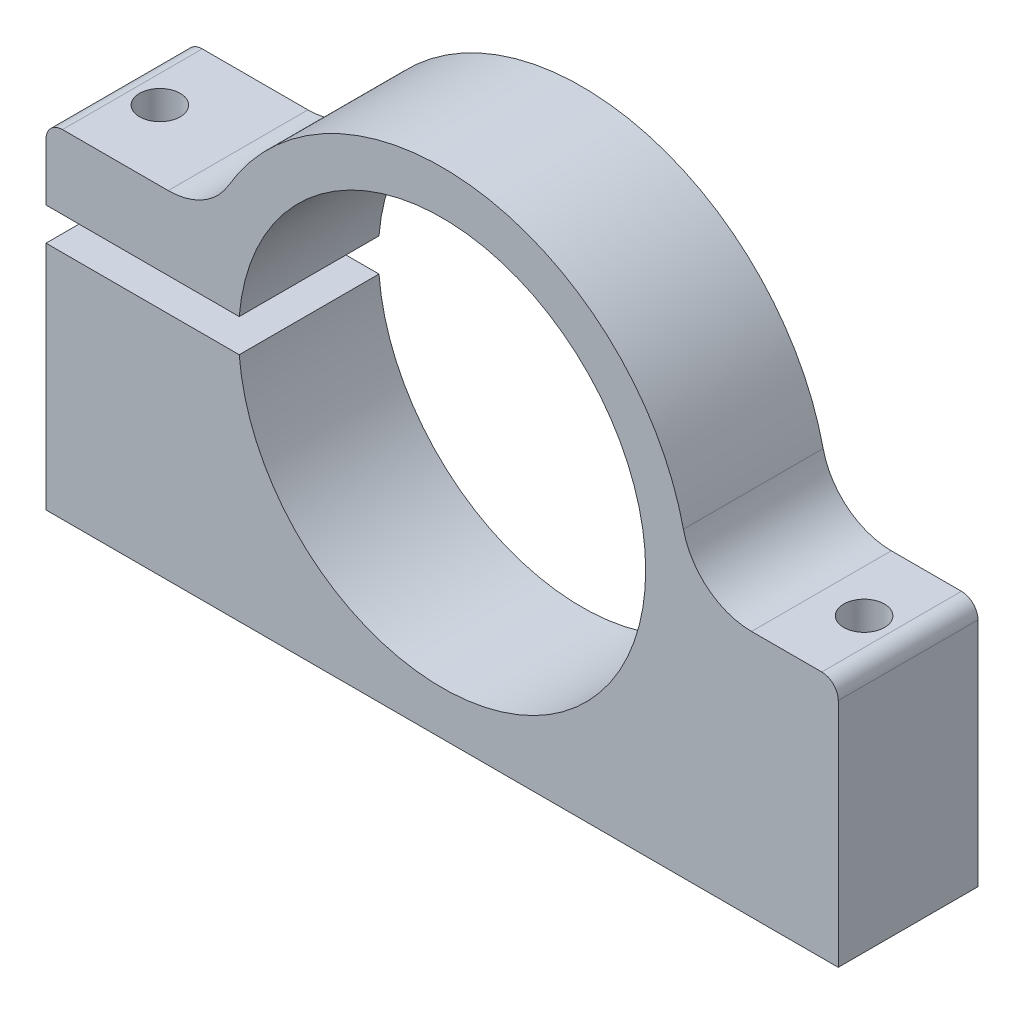
ISO-10303-21;
HEADER;
FILE_DESCRIPTION(('STEP AP214'),'2;1');
FILE_NAME('part.step','',(''),(''),'','','');
FILE_SCHEMA(('AUTOMOTIVE_DESIGN { 1 0 10303 214 1 1 1 1 }'));
ENDSEC;
DATA;
#1=APPLICATION_CONTEXT('core data for automotive mechanical design processes');
#2=APPLICATION_PROTOCOL_DEFINITION('international standard','automotive_design',2000,#1);
#3=PRODUCT_CONTEXT('',#1,'mechanical');
#4=PRODUCT('Part','Part','',(#3));
#5=PRODUCT_RELATED_PRODUCT_CATEGORY('part','',(#4));
#6=PRODUCT_DEFINITION_FORMATION('','',#4);
#7=PRODUCT_DEFINITION_CONTEXT('part definition',#1,'design');
#8=PRODUCT_DEFINITION('design','',#6,#7);
#9=PRODUCT_DEFINITION_SHAPE('','',#8);
#10=(LENGTH_UNIT() NAMED_UNIT(*) SI_UNIT(.MILLI.,.METRE.));
#11=(NAMED_UNIT(*) PLANE_ANGLE_UNIT() SI_UNIT($,.RADIAN.));
#12=(NAMED_UNIT(*) SI_UNIT($,.STERADIAN.) SOLID_ANGLE_UNIT());
#13=UNCERTAINTY_MEASURE_WITH_UNIT(LENGTH_MEASURE(1.E-05),#10,'distance_accuracy_value','');
#14=(GEOMETRIC_REPRESENTATION_CONTEXT(3) GLOBAL_UNCERTAINTY_ASSIGNED_CONTEXT((#13)) GLOBAL_UNIT_ASSIGNED_CONTEXT((#10,
#11,#12)) REPRESENTATION_CONTEXT('',''));
#15=CARTESIAN_POINT('',(0.,0.,0.));
#16=DIRECTION('',(0.,0.,1.));
#17=DIRECTION('',(1.,0.,0.));
#18=AXIS2_PLACEMENT_3D('',#15,#16,#17);
#19=CARTESIAN_POINT('',(-22.4298996876937,1.5,-12.7));
#20=DIRECTION('',(0.,1.,0.));
#21=DIRECTION('',(-1.,0.,0.));
#22=AXIS2_PLACEMENT_3D('',#19,#20,#21);
#23=PLANE('',#22);
#24=CARTESIAN_POINT('',(-32.,1.5,-6.35));
#25=DIRECTION('',(0.,1.,0.));
#26=DIRECTION('',(-1.,0.,0.));
#27=AXIS2_PLACEMENT_3D('',#24,#25,#26);
#28=CIRCLE('',#27,1.85);
#29=CARTESIAN_POINT('',(-33.85,1.5,-6.35));
#30=VERTEX_POINT('',#29);
#31=EDGE_CURVE('E154',#30,#30,#28,.T.);
#32=ORIENTED_EDGE('',*,*,#31,.T.);
#33=EDGE_LOOP('',(#32));
#34=FACE_BOUND('',#33,.T.);
#35=DIRECTION('',(-1.,0.,0.));
#36=VECTOR('',#35,1.);
#37=CARTESIAN_POINT('',(-22.4298996876937,1.5,0.));
#38=LINE('',#37,#36);
#39=CARTESIAN_POINT('',(-18.4390889145858,1.5,0.));
#40=VERTEX_POINT('',#39);
#41=CARTESIAN_POINT('',(-36.,1.5,0.));
#42=VERTEX_POINT('',#41);
#43=EDGE_CURVE('E143',#40,#42,#38,.T.);
#44=ORIENTED_EDGE('',*,*,#43,.T.);
#45=DIRECTION('',(0.,0.,1.));
#46=VECTOR('',#45,1.);
#47=CARTESIAN_POINT('',(-36.,1.5,-12.7));
#48=LINE('',#47,#46);
#49=CARTESIAN_POINT('',(-36.,1.5,-12.7));
#50=VERTEX_POINT('',#49);
#51=EDGE_CURVE('E203',#50,#42,#48,.T.);
#52=ORIENTED_EDGE('',*,*,#51,.F.);
#53=DIRECTION('',(-1.,0.,0.));
#54=VECTOR('',#53,1.);
#55=CARTESIAN_POINT('',(-22.4298996876937,1.5,-12.7));
#56=LINE('',#55,#54);
#57=CARTESIAN_POINT('',(-18.4390889145858,1.50000000000001,-12.7));
#58=VERTEX_POINT('',#57);
#59=EDGE_CURVE('E182',#58,#50,#56,.T.);
#60=ORIENTED_EDGE('',*,*,#59,.F.);
#61=DIRECTION('',(0.,0.,1.));
#62=VECTOR('',#61,1.);
#63=CARTESIAN_POINT('',(-18.4390889145858,1.5,-12.7));
#64=LINE('',#63,#62);
#65=EDGE_CURVE('E153',#58,#40,#64,.T.);
#66=ORIENTED_EDGE('',*,*,#65,.T.);
#67=EDGE_LOOP('',(#44,#52,#60,#66));
#68=FACE_BOUND('',#67,.T.);
#69=ADVANCED_FACE('F32',(#34,#68),#23,.F.);
#70=CARTESIAN_POINT('',(-36.,1.5,-12.7));
#71=DIRECTION('',(1.,0.,0.));
#72=DIRECTION('',(0.,0.,-1.));
#73=AXIS2_PLACEMENT_3D('',#70,#71,#72);
#74=PLANE('',#73);
#75=DIRECTION('',(0.,1.,0.));
#76=VECTOR('',#75,1.);
#77=CARTESIAN_POINT('',(-36.,1.5,0.));
#78=LINE('',#77,#76);
#79=CARTESIAN_POINT('',(-36.,6.69101756633617,0.));
#80=VERTEX_POINT('',#79);
#81=EDGE_CURVE('E200',#42,#80,#78,.T.);
#82=ORIENTED_EDGE('',*,*,#81,.T.);
#83=DIRECTION('',(0.,0.,1.));
#84=VECTOR('',#83,1.);
#85=CARTESIAN_POINT('',(-36.,6.69101756633617,-12.7));
#86=LINE('',#85,#84);
#87=CARTESIAN_POINT('',(-36.,6.69101756633617,-12.7));
#88=VERTEX_POINT('',#87);
#89=EDGE_CURVE('E40',#80,#88,#86,.F.);
#90=ORIENTED_EDGE('',*,*,#89,.T.);
#91=DIRECTION('',(0.,1.,0.));
#92=VECTOR('',#91,1.);
#93=CARTESIAN_POINT('',(-36.,1.5,-12.7));
#94=LINE('',#93,#92);
#95=EDGE_CURVE('E180',#50,#88,#94,.T.);
#96=ORIENTED_EDGE('',*,*,#95,.F.);
#97=ORIENTED_EDGE('',*,*,#51,.T.);
#98=EDGE_LOOP('',(#82,#90,#96,#97));
#99=FACE_BOUND('',#98,.T.);
#100=ADVANCED_FACE('F324',(#99),#74,.F.);
#101=CARTESIAN_POINT('',(-36.,8.19101756633617,-12.7));
#102=DIRECTION('',(0.,-1.,0.));
#103=DIRECTION('',(1.,0.,0.));
#104=AXIS2_PLACEMENT_3D('',#101,#102,#103);
#105=PLANE('',#104);
#106=CARTESIAN_POINT('',(-32.,8.19101756633617,-6.35));
#107=DIRECTION('',(0.,1.,0.));
#108=DIRECTION('',(-1.,0.,0.));
#109=AXIS2_PLACEMENT_3D('',#106,#107,#108);
#110=CIRCLE('',#109,1.85);
#111=CARTESIAN_POINT('',(-33.85,8.19101756633618,-6.35));
#112=VERTEX_POINT('',#111);
#113=EDGE_CURVE('E293',#112,#112,#110,.T.);
#114=ORIENTED_EDGE('',*,*,#113,.F.);
#115=EDGE_LOOP('',(#114));
#116=FACE_BOUND('',#115,.T.);
#117=DIRECTION('',(1.,0.,0.));
#118=VECTOR('',#117,1.);
#119=CARTESIAN_POINT('',(-36.,8.19101756633617,-12.7));
#120=LINE('',#119,#118);
#121=CARTESIAN_POINT('',(-34.5,8.19101756633617,-12.7));
#122=VERTEX_POINT('',#121);
#123=CARTESIAN_POINT('',(-24.8943308432965,8.19101756633617,-12.7));
#124=VERTEX_POINT('',#123);
#125=EDGE_CURVE('E178',#122,#124,#120,.T.);
#126=ORIENTED_EDGE('',*,*,#125,.F.);
#127=DIRECTION('',(0.,0.,1.));
#128=VECTOR('',#127,1.);
#129=CARTESIAN_POINT('',(-34.5,8.19101756633617,-12.7));
#130=LINE('',#129,#128);
#131=CARTESIAN_POINT('',(-34.5,8.19101756633617,0.));
#132=VERTEX_POINT('',#131);
#133=EDGE_CURVE('E245',#122,#132,#130,.T.);
#134=ORIENTED_EDGE('',*,*,#133,.T.);
#135=DIRECTION('',(1.,0.,0.));
#136=VECTOR('',#135,1.);
#137=CARTESIAN_POINT('',(-36.,8.19101756633617,0.));
#138=LINE('',#137,#136);
#139=CARTESIAN_POINT('',(-24.8943308432965,8.19101756633617,0.));
#140=VERTEX_POINT('',#139);
#141=EDGE_CURVE('E198',#132,#140,#138,.T.);
#142=ORIENTED_EDGE('',*,*,#141,.T.);
#143=DIRECTION('',(0.,0.,1.));
#144=VECTOR('',#143,1.);
#145=CARTESIAN_POINT('',(-24.8943308432965,8.19101756633617,-12.7));
#146=LINE('',#145,#144);
#147=EDGE_CURVE('E228',#140,#124,#146,.F.);
#148=ORIENTED_EDGE('',*,*,#147,.T.);
#149=EDGE_LOOP('',(#126,#134,#142,#148));
#150=FACE_BOUND('',#149,.T.);
#151=ADVANCED_FACE('F251',(#116,#150),#105,.F.);
#152=CARTESIAN_POINT('',(0.,0.,-12.7));
#153=DIRECTION('',(0.,0.,1.));
#154=DIRECTION('',(1.,0.,0.));
#155=AXIS2_PLACEMENT_3D('',#152,#153,#154);
#156=CYLINDRICAL_SURFACE('',#155,22.48);
#157=CARTESIAN_POINT('',(0.,0.,-12.7));
#158=DIRECTION('',(0.,0.,1.));
#159=DIRECTION('',(1.,0.,0.));
#160=AXIS2_PLACEMENT_3D('',#157,#158,#159);
#161=CIRCLE('',#160,22.48);
#162=CARTESIAN_POINT('',(21.9279350173925,4.95137010058966,-12.7));
#163=VERTEX_POINT('',#162);
#164=CARTESIAN_POINT('',(-19.4111882538087,11.3382613559222,-12.7));
#165=VERTEX_POINT('',#164);
#166=EDGE_CURVE('E175',#163,#165,#161,.T.);
#167=ORIENTED_EDGE('',*,*,#166,.T.);
#168=DIRECTION('',(0.,0.,1.));
#169=VECTOR('',#168,1.);
#170=CARTESIAN_POINT('',(-19.4111882538087,11.3382613559222,-12.7));
#171=LINE('',#170,#169);
#172=CARTESIAN_POINT('',(-19.4111882538087,11.3382613559222,0.));
#173=VERTEX_POINT('',#172);
#174=EDGE_CURVE('E225',#165,#173,#171,.T.);
#175=ORIENTED_EDGE('',*,*,#174,.T.);
#176=CARTESIAN_POINT('',(0.,0.,0.));
#177=DIRECTION('',(0.,0.,1.));
#178=DIRECTION('',(1.,0.,0.));
#179=AXIS2_PLACEMENT_3D('',#176,#177,#178);
#180=CIRCLE('',#179,22.48);
#181=CARTESIAN_POINT('',(21.9279350173925,4.95137010058966,0.));
#182=VERTEX_POINT('',#181);
#183=EDGE_CURVE('E195',#182,#173,#180,.T.);
#184=ORIENTED_EDGE('',*,*,#183,.F.);
#185=DIRECTION('',(0.,0.,1.));
#186=VECTOR('',#185,1.);
#187=CARTESIAN_POINT('',(21.9279350173925,4.95137010058966,-12.7));
#188=LINE('',#187,#186);
#189=EDGE_CURVE('E218',#182,#163,#188,.F.);
#190=ORIENTED_EDGE('',*,*,#189,.T.);
#191=EDGE_LOOP('',(#167,#175,#184,#190));
#192=FACE_BOUND('',#191,.T.);
#193=ADVANCED_FACE('F264',(#192),#156,.T.);
#194=CARTESIAN_POINT('',(36.,0.,-12.7));
#195=DIRECTION('',(0.,1.,0.));
#196=DIRECTION('',(-1.,0.,0.));
#197=AXIS2_PLACEMENT_3D('',#194,#195,#196);
#198=PLANE('',#197);
#199=CARTESIAN_POINT('',(32.,0.,-6.35));
#200=DIRECTION('',(0.,1.,0.));
#201=DIRECTION('',(-1.,0.,0.));
#202=AXIS2_PLACEMENT_3D('',#199,#200,#201);
#203=CIRCLE('',#202,1.85);
#204=CARTESIAN_POINT('',(30.15,0.,-6.35));
#205=VERTEX_POINT('',#204);
#206=EDGE_CURVE('E299',#205,#205,#203,.T.);
#207=ORIENTED_EDGE('',*,*,#206,.F.);
#208=EDGE_LOOP('',(#207));
#209=FACE_BOUND('',#208,.T.);
#210=DIRECTION('',(-1.,0.,0.));
#211=VECTOR('',#210,1.);
#212=CARTESIAN_POINT('',(36.,0.,0.));
#213=LINE('',#212,#211);
#214=CARTESIAN_POINT('',(34.5,0.,0.));
#215=VERTEX_POINT('',#214);
#216=CARTESIAN_POINT('',(28.1219913946363,0.,0.));
#217=VERTEX_POINT('',#216);
#218=EDGE_CURVE('E193',#215,#217,#213,.T.);
#219=ORIENTED_EDGE('',*,*,#218,.F.);
#220=DIRECTION('',(0.,0.,1.));
#221=VECTOR('',#220,1.);
#222=CARTESIAN_POINT('',(34.5,0.,-12.7));
#223=LINE('',#222,#221);
#224=CARTESIAN_POINT('',(34.5,0.,-12.7));
#225=VERTEX_POINT('',#224);
#226=EDGE_CURVE('E241',#215,#225,#223,.F.);
#227=ORIENTED_EDGE('',*,*,#226,.T.);
#228=DIRECTION('',(-1.,0.,0.));
#229=VECTOR('',#228,1.);
#230=CARTESIAN_POINT('',(36.,0.,-12.7));
#231=LINE('',#230,#229);
#232=CARTESIAN_POINT('',(28.1219913946363,0.,-12.7));
#233=VERTEX_POINT('',#232);
#234=EDGE_CURVE('E173',#225,#233,#231,.T.);
#235=ORIENTED_EDGE('',*,*,#234,.T.);
#236=DIRECTION('',(0.,0.,-1.));
#237=VECTOR('',#236,1.);
#238=CARTESIAN_POINT('',(28.1219913946363,0.,0.));
#239=LINE('',#238,#237);
#240=EDGE_CURVE('E206',#233,#217,#239,.F.);
#241=ORIENTED_EDGE('',*,*,#240,.T.);
#242=EDGE_LOOP('',(#219,#227,#235,#241));
#243=FACE_BOUND('',#242,.T.);
#244=ADVANCED_FACE('F314',(#209,#243),#198,.T.);
#245=CARTESIAN_POINT('',(36.,-22.5,-12.7));
#246=DIRECTION('',(1.,0.,0.));
#247=DIRECTION('',(0.,1.,0.));
#248=AXIS2_PLACEMENT_3D('',#245,#246,#247);
#249=PLANE('',#248);
#250=DIRECTION('',(0.,1.,0.));
#251=VECTOR('',#250,1.);
#252=CARTESIAN_POINT('',(36.,-22.5,-12.7));
#253=LINE('',#252,#251);
#254=CARTESIAN_POINT('',(36.,-22.5,-12.7));
#255=VERTEX_POINT('',#254);
#256=CARTESIAN_POINT('',(36.,-1.5,-12.7));
#257=VERTEX_POINT('',#256);
#258=EDGE_CURVE('E170',#255,#257,#253,.T.);
#259=ORIENTED_EDGE('',*,*,#258,.T.);
#260=DIRECTION('',(0.,0.,1.));
#261=VECTOR('',#260,1.);
#262=CARTESIAN_POINT('',(36.,-1.5,-12.7));
#263=LINE('',#262,#261);
#264=CARTESIAN_POINT('',(36.,-1.5,0.));
#265=VERTEX_POINT('',#264);
#266=EDGE_CURVE('E236',#257,#265,#263,.T.);
#267=ORIENTED_EDGE('',*,*,#266,.T.);
#268=DIRECTION('',(0.,1.,0.));
#269=VECTOR('',#268,1.);
#270=CARTESIAN_POINT('',(36.,-22.5,0.));
#271=LINE('',#270,#269);
#272=CARTESIAN_POINT('',(36.,-22.5,0.));
#273=VERTEX_POINT('',#272);
#274=EDGE_CURVE('E190',#273,#265,#271,.T.);
#275=ORIENTED_EDGE('',*,*,#274,.F.);
#276=DIRECTION('',(0.,0.,1.));
#277=VECTOR('',#276,1.);
#278=CARTESIAN_POINT('',(36.,-22.5,-12.7));
#279=LINE('',#278,#277);
#280=EDGE_CURVE('E207',#255,#273,#279,.T.);
#281=ORIENTED_EDGE('',*,*,#280,.F.);
#282=EDGE_LOOP('',(#259,#267,#275,#281));
#283=FACE_BOUND('',#282,.T.);
#284=ADVANCED_FACE('F280',(#283),#249,.T.);
#285=CARTESIAN_POINT('',(-36.,-22.5,-12.7));
#286=DIRECTION('',(0.,-1.,0.));
#287=DIRECTION('',(0.,0.,-1.));
#288=AXIS2_PLACEMENT_3D('',#285,#286,#287);
#289=PLANE('',#288);
#290=CARTESIAN_POINT('',(32.,-22.5,-6.35));
#291=DIRECTION('',(0.,1.,0.));
#292=DIRECTION('',(-1.,0.,0.));
#293=AXIS2_PLACEMENT_3D('',#290,#291,#292);
#294=CIRCLE('',#293,1.85);
#295=CARTESIAN_POINT('',(30.15,-22.5,-6.35));
#296=VERTEX_POINT('',#295);
#297=EDGE_CURVE('E296',#296,#296,#294,.T.);
#298=ORIENTED_EDGE('',*,*,#297,.T.);
#299=EDGE_LOOP('',(#298));
#300=FACE_BOUND('',#299,.T.);
#301=CARTESIAN_POINT('',(-32.,-22.5,-6.35));
#302=DIRECTION('',(0.,1.,0.));
#303=DIRECTION('',(-1.,0.,0.));
#304=AXIS2_PLACEMENT_3D('',#301,#302,#303);
#305=CIRCLE('',#304,1.85);
#306=CARTESIAN_POINT('',(-33.85,-22.5,-6.35));
#307=VERTEX_POINT('',#306);
#308=EDGE_CURVE('E215',#307,#307,#305,.T.);
#309=ORIENTED_EDGE('',*,*,#308,.T.);
#310=EDGE_LOOP('',(#309));
#311=FACE_BOUND('',#310,.T.);
#312=DIRECTION('',(1.,0.,0.));
#313=VECTOR('',#312,1.);
#314=CARTESIAN_POINT('',(-36.,-22.5,0.));
#315=LINE('',#314,#313);
#316=CARTESIAN_POINT('',(-36.,-22.5,0.));
#317=VERTEX_POINT('',#316);
#318=EDGE_CURVE('E187',#317,#273,#315,.T.);
#319=ORIENTED_EDGE('',*,*,#318,.F.);
#320=DIRECTION('',(0.,0.,1.));
#321=VECTOR('',#320,1.);
#322=CARTESIAN_POINT('',(-36.,-22.5,-12.7));
#323=LINE('',#322,#321);
#324=CARTESIAN_POINT('',(-36.,-22.5,-12.7));
#325=VERTEX_POINT('',#324);
#326=EDGE_CURVE('E209',#325,#317,#323,.T.);
#327=ORIENTED_EDGE('',*,*,#326,.F.);
#328=DIRECTION('',(1.,0.,0.));
#329=VECTOR('',#328,1.);
#330=CARTESIAN_POINT('',(-36.,-22.5,-12.7));
#331=LINE('',#330,#329);
#332=EDGE_CURVE('E167',#325,#255,#331,.T.);
#333=ORIENTED_EDGE('',*,*,#332,.T.);
#334=ORIENTED_EDGE('',*,*,#280,.T.);
#335=EDGE_LOOP('',(#319,#327,#333,#334));
#336=FACE_BOUND('',#335,.T.);
#337=ADVANCED_FACE('F285',(#300,#311,#336),#289,.T.);
#338=CARTESIAN_POINT('',(-36.,-1.5,-12.7));
#339=DIRECTION('',(-1.,0.,0.));
#340=DIRECTION('',(0.,-1.,0.));
#341=AXIS2_PLACEMENT_3D('',#338,#339,#340);
#342=PLANE('',#341);
#343=DIRECTION('',(0.,-1.,0.));
#344=VECTOR('',#343,1.);
#345=CARTESIAN_POINT('',(-36.,-1.5,0.));
#346=LINE('',#345,#344);
#347=CARTESIAN_POINT('',(-36.,-1.5,0.));
#348=VERTEX_POINT('',#347);
#349=EDGE_CURVE('E161',#348,#317,#346,.T.);
#350=ORIENTED_EDGE('',*,*,#349,.F.);
#351=DIRECTION('',(0.,0.,1.));
#352=VECTOR('',#351,1.);
#353=CARTESIAN_POINT('',(-36.,-1.5,-12.7));
#354=LINE('',#353,#352);
#355=CARTESIAN_POINT('',(-36.,-1.5,-12.7));
#356=VERTEX_POINT('',#355);
#357=EDGE_CURVE('E183',#356,#348,#354,.T.);
#358=ORIENTED_EDGE('',*,*,#357,.F.);
#359=DIRECTION('',(0.,-1.,0.));
#360=VECTOR('',#359,1.);
#361=CARTESIAN_POINT('',(-36.,-1.5,-12.7));
#362=LINE('',#361,#360);
#363=EDGE_CURVE('E141',#356,#325,#362,.T.);
#364=ORIENTED_EDGE('',*,*,#363,.T.);
#365=ORIENTED_EDGE('',*,*,#326,.T.);
#366=EDGE_LOOP('',(#350,#358,#364,#365));
#367=FACE_BOUND('',#366,.T.);
#368=ADVANCED_FACE('F287',(#367),#342,.T.);
#369=CARTESIAN_POINT('',(-22.4298996876937,-1.5,-12.7));
#370=DIRECTION('',(0.,1.,0.));
#371=DIRECTION('',(-1.,0.,0.));
#372=AXIS2_PLACEMENT_3D('',#369,#370,#371);
#373=PLANE('',#372);
#374=CARTESIAN_POINT('',(-32.,-1.5,-6.35));
#375=DIRECTION('',(0.,1.,0.));
#376=DIRECTION('',(-1.,0.,0.));
#377=AXIS2_PLACEMENT_3D('',#374,#375,#376);
#378=CIRCLE('',#377,1.85);
#379=CARTESIAN_POINT('',(-33.85,-1.5,-6.35));
#380=VERTEX_POINT('',#379);
#381=EDGE_CURVE('E212',#380,#380,#378,.T.);
#382=ORIENTED_EDGE('',*,*,#381,.F.);
#383=EDGE_LOOP('',(#382));
#384=FACE_BOUND('',#383,.T.);
#385=DIRECTION('',(-1.,0.,0.));
#386=VECTOR('',#385,1.);
#387=CARTESIAN_POINT('',(-22.4298996876937,-1.5,0.));
#388=LINE('',#387,#386);
#389=CARTESIAN_POINT('',(-18.4390889145858,-1.50000000000005,0.));
#390=VERTEX_POINT('',#389);
#391=EDGE_CURVE('E149',#390,#348,#388,.T.);
#392=ORIENTED_EDGE('',*,*,#391,.F.);
#393=DIRECTION('',(0.,0.,1.));
#394=VECTOR('',#393,1.);
#395=CARTESIAN_POINT('',(-18.4390889145858,-1.5,-12.7));
#396=LINE('',#395,#394);
#397=CARTESIAN_POINT('',(-18.4390889145858,-1.5,-12.7));
#398=VERTEX_POINT('',#397);
#399=EDGE_CURVE('E146',#398,#390,#396,.T.);
#400=ORIENTED_EDGE('',*,*,#399,.F.);
#401=DIRECTION('',(-1.,0.,0.));
#402=VECTOR('',#401,1.);
#403=CARTESIAN_POINT('',(-22.4298996876937,-1.5,-12.7));
#404=LINE('',#403,#402);
#405=EDGE_CURVE('E134',#398,#356,#404,.T.);
#406=ORIENTED_EDGE('',*,*,#405,.T.);
#407=ORIENTED_EDGE('',*,*,#357,.T.);
#408=EDGE_LOOP('',(#392,#400,#406,#407));
#409=FACE_BOUND('',#408,.T.);
#410=ADVANCED_FACE('F147',(#384,#409),#373,.T.);
#411=CARTESIAN_POINT('',(0.,0.,-12.7));
#412=DIRECTION('',(0.,0.,1.));
#413=DIRECTION('',(1.,0.,0.));
#414=AXIS2_PLACEMENT_3D('',#411,#412,#413);
#415=PLANE('',#414);
#416=ORIENTED_EDGE('',*,*,#95,.T.);
#417=CARTESIAN_POINT('',(-34.5,6.69101756633617,-12.7));
#418=DIRECTION('',(0.,0.,1.));
#419=DIRECTION('',(1.,0.,0.));
#420=AXIS2_PLACEMENT_3D('',#417,#418,#419);
#421=CIRCLE('',#420,1.5);
#422=EDGE_CURVE('E11',#88,#122,#421,.F.);
#423=ORIENTED_EDGE('',*,*,#422,.T.);
#424=ORIENTED_EDGE('',*,*,#125,.T.);
#425=CARTESIAN_POINT('',(-24.8943308432965,14.5410175663362,-12.7));
#426=DIRECTION('',(0.,0.,1.));
#427=DIRECTION('',(1.,0.,0.));
#428=AXIS2_PLACEMENT_3D('',#425,#426,#427);
#429=CIRCLE('',#428,6.35);
#430=EDGE_CURVE('E234',#124,#165,#429,.T.);
#431=ORIENTED_EDGE('',*,*,#430,.T.);
#432=ORIENTED_EDGE('',*,*,#166,.F.);
#433=CARTESIAN_POINT('',(28.1219913946363,6.35,-12.7));
#434=DIRECTION('',(0.,0.,1.));
#435=DIRECTION('',(1.,0.,0.));
#436=AXIS2_PLACEMENT_3D('',#433,#434,#435);
#437=CIRCLE('',#436,6.35);
#438=EDGE_CURVE('E222',#163,#233,#437,.T.);
#439=ORIENTED_EDGE('',*,*,#438,.T.);
#440=ORIENTED_EDGE('',*,*,#234,.F.);
#441=CARTESIAN_POINT('',(34.5,-1.5,-12.7));
#442=DIRECTION('',(0.,0.,1.));
#443=DIRECTION('',(1.,0.,0.));
#444=AXIS2_PLACEMENT_3D('',#441,#442,#443);
#445=CIRCLE('',#444,1.5);
#446=EDGE_CURVE('E243',#225,#257,#445,.F.);
#447=ORIENTED_EDGE('',*,*,#446,.T.);
#448=ORIENTED_EDGE('',*,*,#258,.F.);
#449=ORIENTED_EDGE('',*,*,#332,.F.);
#450=ORIENTED_EDGE('',*,*,#363,.F.);
#451=ORIENTED_EDGE('',*,*,#405,.F.);
#452=CARTESIAN_POINT('',(0.,0.,-12.7));
#453=DIRECTION('',(0.,0.,1.));
#454=DIRECTION('',(1.,0.,0.));
#455=AXIS2_PLACEMENT_3D('',#452,#453,#454);
#456=CIRCLE('',#455,18.5);
#457=EDGE_CURVE('E138',#398,#58,#456,.T.);
#458=ORIENTED_EDGE('',*,*,#457,.T.);
#459=ORIENTED_EDGE('',*,*,#59,.T.);
#460=EDGE_LOOP('',(#416,#423,#424,#431,#432,#439,#440,#447,#448,#449,#450,#451,#458,#459));
#461=FACE_BOUND('',#460,.T.);
#462=ADVANCED_FACE('F136',(#461),#415,.F.);
#463=CARTESIAN_POINT('',(0.,0.,0.));
#464=DIRECTION('',(0.,0.,1.));
#465=DIRECTION('',(1.,0.,0.));
#466=AXIS2_PLACEMENT_3D('',#463,#464,#465);
#467=PLANE('',#466);
#468=ORIENTED_EDGE('',*,*,#141,.F.);
#469=CARTESIAN_POINT('',(-34.5,6.69101756633617,0.));
#470=DIRECTION('',(0.,0.,1.));
#471=DIRECTION('',(1.,0.,0.));
#472=AXIS2_PLACEMENT_3D('',#469,#470,#471);
#473=CIRCLE('',#472,1.5);
#474=EDGE_CURVE('E54',#132,#80,#473,.T.);
#475=ORIENTED_EDGE('',*,*,#474,.T.);
#476=ORIENTED_EDGE('',*,*,#81,.F.);
#477=ORIENTED_EDGE('',*,*,#43,.F.);
#478=CARTESIAN_POINT('',(0.,0.,0.));
#479=DIRECTION('',(0.,0.,1.));
#480=DIRECTION('',(1.,0.,0.));
#481=AXIS2_PLACEMENT_3D('',#478,#479,#480);
#482=CIRCLE('',#481,18.5);
#483=EDGE_CURVE('E159',#390,#40,#482,.T.);
#484=ORIENTED_EDGE('',*,*,#483,.F.);
#485=ORIENTED_EDGE('',*,*,#391,.T.);
#486=ORIENTED_EDGE('',*,*,#349,.T.);
#487=ORIENTED_EDGE('',*,*,#318,.T.);
#488=ORIENTED_EDGE('',*,*,#274,.T.);
#489=CARTESIAN_POINT('',(34.5,-1.5,0.));
#490=DIRECTION('',(0.,0.,1.));
#491=DIRECTION('',(1.,0.,0.));
#492=AXIS2_PLACEMENT_3D('',#489,#490,#491);
#493=CIRCLE('',#492,1.5);
#494=EDGE_CURVE('E239',#265,#215,#493,.T.);
#495=ORIENTED_EDGE('',*,*,#494,.T.);
#496=ORIENTED_EDGE('',*,*,#218,.T.);
#497=CARTESIAN_POINT('',(28.1219913946363,6.35,0.));
#498=DIRECTION('',(0.,0.,1.));
#499=DIRECTION('',(1.,0.,0.));
#500=AXIS2_PLACEMENT_3D('',#497,#498,#499);
#501=CIRCLE('',#500,6.35);
#502=EDGE_CURVE('E220',#217,#182,#501,.F.);
#503=ORIENTED_EDGE('',*,*,#502,.T.);
#504=ORIENTED_EDGE('',*,*,#183,.T.);
#505=CARTESIAN_POINT('',(-24.8943308432965,14.5410175663362,0.));
#506=DIRECTION('',(0.,0.,1.));
#507=DIRECTION('',(1.,0.,0.));
#508=AXIS2_PLACEMENT_3D('',#505,#506,#507);
#509=CIRCLE('',#508,6.35);
#510=EDGE_CURVE('E231',#173,#140,#509,.F.);
#511=ORIENTED_EDGE('',*,*,#510,.T.);
#512=EDGE_LOOP('',(#468,#475,#476,#477,#484,#485,#486,#487,#488,#495,#496,#503,#504,#511));
#513=FACE_BOUND('',#512,.T.);
#514=ADVANCED_FACE('F254',(#513),#467,.T.);
#515=CARTESIAN_POINT('',(0.,0.,-12.7));
#516=DIRECTION('',(0.,0.,1.));
#517=DIRECTION('',(1.,0.,0.));
#518=AXIS2_PLACEMENT_3D('',#515,#516,#517);
#519=CYLINDRICAL_SURFACE('',#518,18.5);
#520=ORIENTED_EDGE('',*,*,#483,.T.);
#521=ORIENTED_EDGE('',*,*,#65,.F.);
#522=ORIENTED_EDGE('',*,*,#457,.F.);
#523=ORIENTED_EDGE('',*,*,#399,.T.);
#524=EDGE_LOOP('',(#520,#521,#522,#523));
#525=FACE_BOUND('',#524,.T.);
#526=ADVANCED_FACE('F157',(#525),#519,.F.);
#527=CARTESIAN_POINT('',(-32.,-22.5,-6.35));
#528=DIRECTION('',(0.,1.,0.));
#529=DIRECTION('',(-1.,0.,0.));
#530=AXIS2_PLACEMENT_3D('',#527,#528,#529);
#531=CYLINDRICAL_SURFACE('',#530,1.85);
#532=CARTESIAN_POINT('',(-33.85,-1.5,-6.35));
#533=CARTESIAN_POINT('',(-33.85,-1.71875,-6.35));
#534=CARTESIAN_POINT('',(-33.85,-1.93750000000001,-6.35));
#535=CARTESIAN_POINT('',(-33.85,-2.37500000000001,-6.35));
#536=CARTESIAN_POINT('',(-33.85,-2.59375000000001,-6.35));
#537=CARTESIAN_POINT('',(-33.85,-3.03125000000001,-6.35));
#538=CARTESIAN_POINT('',(-33.85,-3.25000000000001,-6.35));
#539=CARTESIAN_POINT('',(-33.85,-3.68750000000001,-6.35));
#540=CARTESIAN_POINT('',(-33.85,-3.90625000000001,-6.35));
#541=CARTESIAN_POINT('',(-33.85,-4.34375000000001,-6.35));
#542=CARTESIAN_POINT('',(-33.85,-4.56250000000001,-6.35));
#543=CARTESIAN_POINT('',(-33.85,-5.,-6.35));
#544=CARTESIAN_POINT('',(-33.85,-5.21875,-6.35));
#545=CARTESIAN_POINT('',(-33.85,-5.65625000000001,-6.35));
#546=CARTESIAN_POINT('',(-33.85,-5.87500000000001,-6.35));
#547=CARTESIAN_POINT('',(-33.85,-6.31250000000001,-6.35));
#548=CARTESIAN_POINT('',(-33.85,-6.53125000000001,-6.35));
#549=CARTESIAN_POINT('',(-33.85,-6.96875000000001,-6.35));
#550=CARTESIAN_POINT('',(-33.85,-7.18750000000001,-6.35));
#551=CARTESIAN_POINT('',(-33.85,-7.62500000000001,-6.35));
#552=CARTESIAN_POINT('',(-33.85,-7.84375000000001,-6.35));
#553=CARTESIAN_POINT('',(-33.85,-8.28125000000001,-6.35));
#554=CARTESIAN_POINT('',(-33.85,-8.5,-6.35));
#555=CARTESIAN_POINT('',(-33.85,-8.93750000000001,-6.35));
#556=CARTESIAN_POINT('',(-33.85,-9.15625000000001,-6.35));
#557=CARTESIAN_POINT('',(-33.85,-9.59375000000001,-6.35));
#558=CARTESIAN_POINT('',(-33.85,-9.81250000000001,-6.35));
#559=CARTESIAN_POINT('',(-33.85,-10.25,-6.35));
#560=CARTESIAN_POINT('',(-33.85,-10.46875,-6.35));
#561=CARTESIAN_POINT('',(-33.85,-10.90625,-6.35));
#562=CARTESIAN_POINT('',(-33.85,-11.125,-6.35));
#563=CARTESIAN_POINT('',(-33.85,-11.5625,-6.35));
#564=CARTESIAN_POINT('',(-33.85,-11.78125,-6.35));
#565=CARTESIAN_POINT('',(-33.85,-12.21875,-6.35));
#566=CARTESIAN_POINT('',(-33.85,-12.4375,-6.35));
#567=CARTESIAN_POINT('',(-33.85,-12.875,-6.35));
#568=CARTESIAN_POINT('',(-33.85,-13.09375,-6.35));
#569=CARTESIAN_POINT('',(-33.85,-13.53125,-6.35));
#570=CARTESIAN_POINT('',(-33.85,-13.75,-6.35));
#571=CARTESIAN_POINT('',(-33.85,-14.1875,-6.35));
#572=CARTESIAN_POINT('',(-33.85,-14.40625,-6.35));
#573=CARTESIAN_POINT('',(-33.85,-14.84375,-6.35));
#574=CARTESIAN_POINT('',(-33.85,-15.0625,-6.35));
#575=CARTESIAN_POINT('',(-33.85,-15.5,-6.35));
#576=CARTESIAN_POINT('',(-33.85,-15.71875,-6.35));
#577=CARTESIAN_POINT('',(-33.85,-16.15625,-6.35));
#578=CARTESIAN_POINT('',(-33.85,-16.375,-6.35));
#579=CARTESIAN_POINT('',(-33.85,-16.8125,-6.35));
#580=CARTESIAN_POINT('',(-33.85,-17.03125,-6.35));
#581=CARTESIAN_POINT('',(-33.85,-17.46875,-6.35));
#582=CARTESIAN_POINT('',(-33.85,-17.6875,-6.35));
#583=CARTESIAN_POINT('',(-33.85,-18.125,-6.35));
#584=CARTESIAN_POINT('',(-33.85,-18.34375,-6.35));
#585=CARTESIAN_POINT('',(-33.85,-18.78125,-6.35));
#586=CARTESIAN_POINT('',(-33.85,-19.,-6.35));
#587=CARTESIAN_POINT('',(-33.85,-19.4375,-6.35));
#588=CARTESIAN_POINT('',(-33.85,-19.65625,-6.35));
#589=CARTESIAN_POINT('',(-33.85,-20.09375,-6.35));
#590=CARTESIAN_POINT('',(-33.85,-20.3125,-6.35));
#591=CARTESIAN_POINT('',(-33.85,-20.75,-6.35));
#592=CARTESIAN_POINT('',(-33.85,-20.96875,-6.35));
#593=CARTESIAN_POINT('',(-33.85,-21.40625,-6.35));
#594=CARTESIAN_POINT('',(-33.85,-21.625,-6.35));
#595=CARTESIAN_POINT('',(-33.85,-22.0625,-6.35));
#596=CARTESIAN_POINT('',(-33.85,-22.28125,-6.35));
#597=CARTESIAN_POINT('',(-33.85,-22.5,-6.35));
#598=B_SPLINE_CURVE_WITH_KNOTS('',3,(#532,#533,#534,#535,#536,#537,#538,#539,#540,#541,#542,
#543,#544,#545,#546,#547,#548,#549,#550,#551,#552,#553,#554,#555,#556,#557,#558,#559,#560,#561,
#562,#563,#564,#565,#566,#567,#568,#569,#570,#571,#572,#573,#574,#575,#576,#577,#578,#579,#580,
#581,#582,#583,#584,#585,#586,#587,#588,#589,#590,#591,#592,#593,#594,#595,#596,#597),
.UNSPECIFIED.,.F.,.F.,(4,2,2,2,2,2,2,2,2,2,2,2,2,2,2,2,2,2,2,2,2,2,2,2,2,2,2,2,2,2,2,2,4),(0.,
0.656250000000001,1.3125,1.96875,2.625,3.28125,3.9375,4.59375,5.25,5.90625,6.5625,7.21875,7.875,
8.53125,9.1875,9.84375,10.5,11.15625,11.8125,12.46875,13.125,13.78125,14.4375,15.09375,15.75,
16.40625,17.0625,17.71875,18.375,19.03125,19.6875,20.34375,21.),.UNSPECIFIED.);
#599=EDGE_CURVE('BSEAM342',#380,#307,#598,.T.);
#600=ORIENTED_EDGE('',*,*,#381,.T.);
#601=ORIENTED_EDGE('',*,*,#308,.F.);
#602=ORIENTED_EDGE('',*,*,#599,.T.);
#603=ORIENTED_EDGE('',*,*,#599,.F.);
#604=EDGE_LOOP('',(#600,#602,#601,#603));
#605=FACE_BOUND('',#604,.T.);
#606=ADVANCED_FACE('F342',(#605),#531,.F.);
#607=CARTESIAN_POINT('',(-33.85,8.19101756633618,-6.35));
#608=CARTESIAN_POINT('',(-33.85,8.12131946668684,-6.35));
#609=CARTESIAN_POINT('',(-33.85,8.05162136703751,-6.35));
#610=CARTESIAN_POINT('',(-33.85,7.91222516773884,-6.35));
#611=CARTESIAN_POINT('',(-33.85,7.8425270680895,-6.35));
#612=CARTESIAN_POINT('',(-33.85,7.70313086879083,-6.35));
#613=CARTESIAN_POINT('',(-33.85,7.6334327691415,-6.35));
#614=CARTESIAN_POINT('',(-33.85,7.49403656984283,-6.35));
#615=CARTESIAN_POINT('',(-33.85,7.42433847019349,-6.35));
#616=CARTESIAN_POINT('',(-33.85,7.28494227089482,-6.35));
#617=CARTESIAN_POINT('',(-33.85,7.21524417124548,-6.35));
#618=CARTESIAN_POINT('',(-33.85,7.07584797194681,-6.35));
#619=CARTESIAN_POINT('',(-33.85,7.00614987229748,-6.35));
#620=CARTESIAN_POINT('',(-33.85,6.86675367299881,-6.35));
#621=CARTESIAN_POINT('',(-33.85,6.79705557334947,-6.35));
#622=CARTESIAN_POINT('',(-33.85,6.6576593740508,-6.35));
#623=CARTESIAN_POINT('',(-33.85,6.58796127440147,-6.35));
#624=CARTESIAN_POINT('',(-33.85,6.4485650751028,-6.35));
#625=CARTESIAN_POINT('',(-33.85,6.37886697545346,-6.35));
#626=CARTESIAN_POINT('',(-33.85,6.23947077615479,-6.35));
#627=CARTESIAN_POINT('',(-33.85,6.16977267650546,-6.35));
#628=CARTESIAN_POINT('',(-33.85,6.03037647720679,-6.35));
#629=CARTESIAN_POINT('',(-33.85,5.96067837755745,-6.35));
#630=CARTESIAN_POINT('',(-33.85,5.82128217825878,-6.35));
#631=CARTESIAN_POINT('',(-33.85,5.75158407860945,-6.35));
#632=CARTESIAN_POINT('',(-33.85,5.61218787931077,-6.35));
#633=CARTESIAN_POINT('',(-33.85,5.54248977966144,-6.35));
#634=CARTESIAN_POINT('',(-33.85,5.40309358036277,-6.35));
#635=CARTESIAN_POINT('',(-33.85,5.33339548071343,-6.35));
#636=CARTESIAN_POINT('',(-33.85,5.19399928141476,-6.35));
#637=CARTESIAN_POINT('',(-33.85,5.12430118176543,-6.35));
#638=CARTESIAN_POINT('',(-33.85,4.98490498246676,-6.35));
#639=CARTESIAN_POINT('',(-33.85,4.91520688281742,-6.35));
#640=CARTESIAN_POINT('',(-33.85,4.77581068351875,-6.35));
#641=CARTESIAN_POINT('',(-33.85,4.70611258386942,-6.35));
#642=CARTESIAN_POINT('',(-33.85,4.56671638457075,-6.35));
#643=CARTESIAN_POINT('',(-33.85,4.49701828492141,-6.35));
#644=CARTESIAN_POINT('',(-33.85,4.35762208562274,-6.35));
#645=CARTESIAN_POINT('',(-33.85,4.28792398597341,-6.35));
#646=CARTESIAN_POINT('',(-33.85,4.14852778667474,-6.35));
#647=CARTESIAN_POINT('',(-33.85,4.0788296870254,-6.35));
#648=CARTESIAN_POINT('',(-33.85,3.93943348772673,-6.35));
#649=CARTESIAN_POINT('',(-33.85,3.8697353880774,-6.35));
#650=CARTESIAN_POINT('',(-33.85,3.73033918877873,-6.35));
#651=CARTESIAN_POINT('',(-33.85,3.66064108912939,-6.35));
#652=CARTESIAN_POINT('',(-33.85,3.52124488983072,-6.35));
#653=CARTESIAN_POINT('',(-33.85,3.45154679018138,-6.35));
#654=CARTESIAN_POINT('',(-33.85,3.31215059088271,-6.35));
#655=CARTESIAN_POINT('',(-33.85,3.24245249123338,-6.35));
#656=CARTESIAN_POINT('',(-33.85,3.10305629193471,-6.35));
#657=CARTESIAN_POINT('',(-33.85,3.03335819228537,-6.35));
#658=CARTESIAN_POINT('',(-33.85,2.8939619929867,-6.35));
#659=CARTESIAN_POINT('',(-33.85,2.82426389333737,-6.35));
#660=CARTESIAN_POINT('',(-33.85,2.6848676940387,-6.35));
#661=CARTESIAN_POINT('',(-33.85,2.61516959438936,-6.35));
#662=CARTESIAN_POINT('',(-33.85,2.47577339509069,-6.35));
#663=CARTESIAN_POINT('',(-33.85,2.40607529544135,-6.35));
#664=CARTESIAN_POINT('',(-33.85,2.26667909614268,-6.35));
#665=CARTESIAN_POINT('',(-33.85,2.19698099649335,-6.35));
#666=CARTESIAN_POINT('',(-33.85,2.05758479719468,-6.35));
#667=CARTESIAN_POINT('',(-33.85,1.98788669754534,-6.35));
#668=CARTESIAN_POINT('',(-33.85,1.84849049824667,-6.35));
#669=CARTESIAN_POINT('',(-33.85,1.77879239859734,-6.35));
#670=CARTESIAN_POINT('',(-33.85,1.63939619929867,-6.35));
#671=CARTESIAN_POINT('',(-33.85,1.56969809964933,-6.35));
#672=CARTESIAN_POINT('',(-33.85,1.5,-6.35));
#673=B_SPLINE_CURVE_WITH_KNOTS('',3,(#607,#608,#609,#610,#611,#612,#613,#614,#615,#616,#617,
#618,#619,#620,#621,#622,#623,#624,#625,#626,#627,#628,#629,#630,#631,#632,#633,#634,#635,#636,
#637,#638,#639,#640,#641,#642,#643,#644,#645,#646,#647,#648,#649,#650,#651,#652,#653,#654,#655,
#656,#657,#658,#659,#660,#661,#662,#663,#664,#665,#666,#667,#668,#669,#670,#671,#672),
.UNSPECIFIED.,.F.,.F.,(4,2,2,2,2,2,2,2,2,2,2,2,2,2,2,2,2,2,2,2,2,2,2,2,2,2,2,2,2,2,2,2,4),(0.,
0.209094298948005,0.41818859789601,0.627282896844016,0.836377195792021,1.04547149474003,
1.25456579368803,1.46366009263604,1.67275439158405,1.88184869053205,2.09094298948006,
2.30003728842806,2.50913158737607,2.71822588632407,2.92732018527208,3.13641448422008,
3.34550878316809,3.55460308211609,3.7636973810641,3.97279168001211,4.18188597896011,
4.39098027790812,4.60007457685612,4.80916887580413,5.01826317475213,5.22735747370014,
5.43645177264815,5.64554607159615,5.85464037054416,6.06373466949216,6.27282896844017,
6.48192326738817,6.69101756633618),.UNSPECIFIED.);
#674=EDGE_CURVE('BSEAM310',#112,#30,#673,.T.);
#675=ORIENTED_EDGE('',*,*,#113,.T.);
#676=ORIENTED_EDGE('',*,*,#31,.F.);
#677=ORIENTED_EDGE('',*,*,#674,.T.);
#678=ORIENTED_EDGE('',*,*,#674,.F.);
#679=EDGE_LOOP('',(#675,#677,#676,#678));
#680=FACE_BOUND('',#679,.T.);
#681=ADVANCED_FACE('F310',(#680),#531,.F.);
#682=CARTESIAN_POINT('',(32.,-22.5,-6.35));
#683=DIRECTION('',(0.,1.,0.));
#684=DIRECTION('',(-1.,0.,0.));
#685=AXIS2_PLACEMENT_3D('',#682,#683,#684);
#686=CYLINDRICAL_SURFACE('',#685,1.85);
#687=ORIENTED_EDGE('',*,*,#297,.F.);
#688=EDGE_LOOP('',(#687));
#689=FACE_BOUND('',#688,.T.);
#690=ORIENTED_EDGE('',*,*,#206,.T.);
#691=EDGE_LOOP('',(#690));
#692=FACE_BOUND('',#691,.T.);
#693=ADVANCED_FACE('F307',(#689,#692),#686,.F.);
#694=CARTESIAN_POINT('',(28.1219913946363,6.35,-12.7));
#695=DIRECTION('',(0.,0.,1.));
#696=DIRECTION('',(1.,0.,0.));
#697=AXIS2_PLACEMENT_3D('',#694,#695,#696);
#698=CYLINDRICAL_SURFACE('',#697,6.35);
#699=ORIENTED_EDGE('',*,*,#438,.F.);
#700=ORIENTED_EDGE('',*,*,#189,.F.);
#701=ORIENTED_EDGE('',*,*,#502,.F.);
#702=ORIENTED_EDGE('',*,*,#240,.F.);
#703=EDGE_LOOP('',(#699,#700,#701,#702));
#704=FACE_BOUND('',#703,.T.);
#705=ADVANCED_FACE('F268',(#704),#698,.F.);
#706=CARTESIAN_POINT('',(-24.8943308432965,14.5410175663362,-12.7));
#707=DIRECTION('',(0.,0.,1.));
#708=DIRECTION('',(1.,0.,0.));
#709=AXIS2_PLACEMENT_3D('',#706,#707,#708);
#710=CYLINDRICAL_SURFACE('',#709,6.35);
#711=ORIENTED_EDGE('',*,*,#430,.F.);
#712=ORIENTED_EDGE('',*,*,#147,.F.);
#713=ORIENTED_EDGE('',*,*,#510,.F.);
#714=ORIENTED_EDGE('',*,*,#174,.F.);
#715=EDGE_LOOP('',(#711,#712,#713,#714));
#716=FACE_BOUND('',#715,.T.);
#717=ADVANCED_FACE('F260',(#716),#710,.F.);
#718=CARTESIAN_POINT('',(34.5,-1.5,-12.7));
#719=DIRECTION('',(0.,0.,1.));
#720=DIRECTION('',(1.,0.,0.));
#721=AXIS2_PLACEMENT_3D('',#718,#719,#720);
#722=CYLINDRICAL_SURFACE('',#721,1.5);
#723=ORIENTED_EDGE('',*,*,#446,.F.);
#724=ORIENTED_EDGE('',*,*,#226,.F.);
#725=ORIENTED_EDGE('',*,*,#494,.F.);
#726=ORIENTED_EDGE('',*,*,#266,.F.);
#727=EDGE_LOOP('',(#723,#724,#725,#726));
#728=FACE_BOUND('',#727,.T.);
#729=ADVANCED_FACE('F277',(#728),#722,.T.);
#730=CARTESIAN_POINT('',(-34.5,6.69101756633617,-12.7));
#731=DIRECTION('',(0.,0.,1.));
#732=DIRECTION('',(1.,0.,0.));
#733=AXIS2_PLACEMENT_3D('',#730,#731,#732);
#734=CYLINDRICAL_SURFACE('',#733,1.5);
#735=ORIENTED_EDGE('',*,*,#422,.F.);
#736=ORIENTED_EDGE('',*,*,#89,.F.);
#737=ORIENTED_EDGE('',*,*,#474,.F.);
#738=ORIENTED_EDGE('',*,*,#133,.F.);
#739=EDGE_LOOP('',(#735,#736,#737,#738));
#740=FACE_BOUND('',#739,.T.);
#741=ADVANCED_FACE('F34',(#740),#734,.T.);
#742=CLOSED_SHELL('',(#69,#100,#151,#193,#244,#284,#337,#368,#410,#462,#514,#526,#606,#681,#693,
#705,#717,#729,#741));
#743=MANIFOLD_SOLID_BREP('B2',#742);
#744=ADVANCED_BREP_SHAPE_REPRESENTATION('',(#18,#743),#14);
#745=SHAPE_DEFINITION_REPRESENTATION(#9,#744);
ENDSEC;
END-ISO-10303-21;
